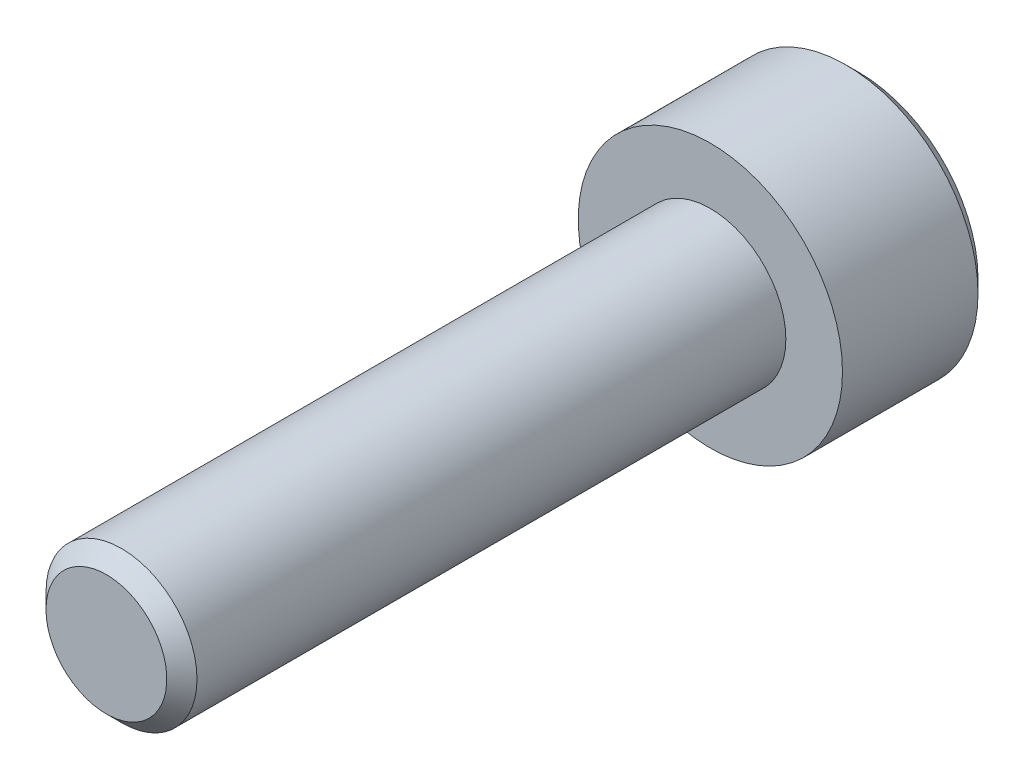
ISO-10303-21;
HEADER;
FILE_DESCRIPTION(('STEP AP214'),'2;1');
FILE_NAME('part.step','',(''),(''),'','','');
FILE_SCHEMA(('AUTOMOTIVE_DESIGN { 1 0 10303 214 1 1 1 1 }'));
ENDSEC;
DATA;
#1=APPLICATION_CONTEXT('core data for automotive mechanical design processes');
#2=APPLICATION_PROTOCOL_DEFINITION('international standard','automotive_design',2000,#1);
#3=PRODUCT_CONTEXT('',#1,'mechanical');
#4=PRODUCT('Part','Part','',(#3));
#5=PRODUCT_RELATED_PRODUCT_CATEGORY('part','',(#4));
#6=PRODUCT_DEFINITION_FORMATION('','',#4);
#7=PRODUCT_DEFINITION_CONTEXT('part definition',#1,'design');
#8=PRODUCT_DEFINITION('design','',#6,#7);
#9=PRODUCT_DEFINITION_SHAPE('','',#8);
#10=(LENGTH_UNIT() NAMED_UNIT(*) SI_UNIT(.MILLI.,.METRE.));
#11=(NAMED_UNIT(*) PLANE_ANGLE_UNIT() SI_UNIT($,.RADIAN.));
#12=(NAMED_UNIT(*) SI_UNIT($,.STERADIAN.) SOLID_ANGLE_UNIT());
#13=UNCERTAINTY_MEASURE_WITH_UNIT(LENGTH_MEASURE(1.E-05),#10,'distance_accuracy_value','');
#14=(GEOMETRIC_REPRESENTATION_CONTEXT(3) GLOBAL_UNCERTAINTY_ASSIGNED_CONTEXT((#13)) GLOBAL_UNIT_ASSIGNED_CONTEXT((#10,
#11,#12)) REPRESENTATION_CONTEXT('',''));
#15=CARTESIAN_POINT('',(0.,0.,0.));
#16=DIRECTION('',(0.,0.,1.));
#17=DIRECTION('',(1.,0.,0.));
#18=AXIS2_PLACEMENT_3D('',#15,#16,#17);
#19=CARTESIAN_POINT('',(1.5,0.866025403784438,-3.94));
#20=DIRECTION('',(1.,0.,0.));
#21=DIRECTION('',(0.,0.,-1.));
#22=AXIS2_PLACEMENT_3D('',#19,#20,#21);
#23=PLANE('',#22);
#24=DIRECTION('',(0.,1.,0.));
#25=VECTOR('',#24,1.);
#26=CARTESIAN_POINT('',(1.5,0.866025403784438,-1.94));
#27=LINE('',#26,#25);
#28=CARTESIAN_POINT('',(1.5,0.866025403784439,-1.94));
#29=VERTEX_POINT('',#28);
#30=CARTESIAN_POINT('',(1.5,-0.866025403784438,-1.94));
#31=VERTEX_POINT('',#30);
#32=EDGE_CURVE('E65',#29,#31,#27,.F.);
#33=ORIENTED_EDGE('',*,*,#32,.F.);
#34=DIRECTION('',(0.,0.,1.));
#35=VECTOR('',#34,1.);
#36=CARTESIAN_POINT('',(1.5,0.866025403784441,-3.94));
#37=LINE('',#36,#35);
#38=CARTESIAN_POINT('',(1.5,0.866025403784439,-3.94));
#39=VERTEX_POINT('',#38);
#40=EDGE_CURVE('E85',#29,#39,#37,.F.);
#41=ORIENTED_EDGE('',*,*,#40,.T.);
#42=DIRECTION('',(0.,1.,0.));
#43=VECTOR('',#42,1.);
#44=CARTESIAN_POINT('',(1.5,0.866025403784438,-3.94));
#45=LINE('',#44,#43);
#46=CARTESIAN_POINT('',(1.5,-0.866025403784438,-3.94));
#47=VERTEX_POINT('',#46);
#48=EDGE_CURVE('E74',#47,#39,#45,.T.);
#49=ORIENTED_EDGE('',*,*,#48,.F.);
#50=DIRECTION('',(0.,0.,1.));
#51=VECTOR('',#50,1.);
#52=CARTESIAN_POINT('',(1.5,-0.866025403784438,-3.94));
#53=LINE('',#52,#51);
#54=EDGE_CURVE('E80',#47,#31,#53,.T.);
#55=ORIENTED_EDGE('',*,*,#54,.T.);
#56=EDGE_LOOP('',(#33,#41,#49,#55));
#57=FACE_BOUND('',#56,.T.);
#58=ADVANCED_FACE('F17',(#57),#23,.F.);
#59=CARTESIAN_POINT('',(1.5,-0.866025403784438,-3.94));
#60=DIRECTION('',(0.499999999999999,-0.866025403784439,0.));
#61=DIRECTION('',(0.866025403784439,0.499999999999999,0.));
#62=AXIS2_PLACEMENT_3D('',#59,#60,#61);
#63=PLANE('',#62);
#64=DIRECTION('',(0.866025403784439,0.499999999999999,0.));
#65=VECTOR('',#64,1.);
#66=CARTESIAN_POINT('',(1.5,-0.866025403784438,-1.94));
#67=LINE('',#66,#65);
#68=CARTESIAN_POINT('',(0.,-1.73205080756888,-1.94));
#69=VERTEX_POINT('',#68);
#70=EDGE_CURVE('E89',#31,#69,#67,.F.);
#71=ORIENTED_EDGE('',*,*,#70,.F.);
#72=ORIENTED_EDGE('',*,*,#54,.F.);
#73=DIRECTION('',(0.866025403784439,0.499999999999999,0.));
#74=VECTOR('',#73,1.);
#75=CARTESIAN_POINT('',(1.5,-0.866025403784438,-3.94));
#76=LINE('',#75,#74);
#77=CARTESIAN_POINT('',(0.,-1.73205080756888,-3.94));
#78=VERTEX_POINT('',#77);
#79=EDGE_CURVE('E70',#78,#47,#76,.T.);
#80=ORIENTED_EDGE('',*,*,#79,.F.);
#81=DIRECTION('',(0.,0.,1.));
#82=VECTOR('',#81,1.);
#83=CARTESIAN_POINT('',(0.,-1.73205080756888,-3.94));
#84=LINE('',#83,#82);
#85=EDGE_CURVE('E133',#78,#69,#84,.T.);
#86=ORIENTED_EDGE('',*,*,#85,.T.);
#87=EDGE_LOOP('',(#71,#72,#80,#86));
#88=FACE_BOUND('',#87,.T.);
#89=ADVANCED_FACE('F88',(#88),#63,.F.);
#90=CARTESIAN_POINT('',(0.,1.73205080756888,-3.94));
#91=DIRECTION('',(0.5,0.866025403784439,0.));
#92=DIRECTION('',(-0.866025403784439,0.5,0.));
#93=AXIS2_PLACEMENT_3D('',#90,#91,#92);
#94=PLANE('',#93);
#95=DIRECTION('',(-0.866025403784438,0.500000000000002,0.));
#96=VECTOR('',#95,1.);
#97=CARTESIAN_POINT('',(1.5,0.866025403784438,-1.94));
#98=LINE('',#97,#96);
#99=CARTESIAN_POINT('',(0.,1.73205080756888,-1.94));
#100=VERTEX_POINT('',#99);
#101=EDGE_CURVE('E128',#29,#100,#98,.T.);
#102=ORIENTED_EDGE('',*,*,#101,.T.);
#103=DIRECTION('',(0.,0.,1.));
#104=VECTOR('',#103,1.);
#105=CARTESIAN_POINT('',(0.,1.73205080756888,-3.94));
#106=LINE('',#105,#104);
#107=CARTESIAN_POINT('',(0.,1.73205080756888,-3.94));
#108=VERTEX_POINT('',#107);
#109=EDGE_CURVE('E120',#100,#108,#106,.F.);
#110=ORIENTED_EDGE('',*,*,#109,.T.);
#111=DIRECTION('',(-0.866025403784439,0.5,0.));
#112=VECTOR('',#111,1.);
#113=CARTESIAN_POINT('',(0.,1.73205080756888,-3.94));
#114=LINE('',#113,#112);
#115=EDGE_CURVE('E91',#39,#108,#114,.T.);
#116=ORIENTED_EDGE('',*,*,#115,.F.);
#117=ORIENTED_EDGE('',*,*,#40,.F.);
#118=EDGE_LOOP('',(#102,#110,#116,#117));
#119=FACE_BOUND('',#118,.T.);
#120=ADVANCED_FACE('F139',(#119),#94,.F.);
#121=CARTESIAN_POINT('',(0.,-1.73205080756888,-3.94));
#122=DIRECTION('',(-0.5,-0.866025403784438,0.));
#123=DIRECTION('',(0.866025403784438,-0.5,0.));
#124=AXIS2_PLACEMENT_3D('',#121,#122,#123);
#125=PLANE('',#124);
#126=DIRECTION('',(0.866025403784438,-0.500000000000002,0.));
#127=VECTOR('',#126,1.);
#128=CARTESIAN_POINT('',(-1.5,-0.866025403784438,-1.94));
#129=LINE('',#128,#127);
#130=CARTESIAN_POINT('',(-1.5,-0.866025403784439,-1.94));
#131=VERTEX_POINT('',#130);
#132=EDGE_CURVE('E130',#131,#69,#129,.T.);
#133=ORIENTED_EDGE('',*,*,#132,.T.);
#134=ORIENTED_EDGE('',*,*,#85,.F.);
#135=DIRECTION('',(0.866025403784438,-0.5,0.));
#136=VECTOR('',#135,1.);
#137=CARTESIAN_POINT('',(0.,-1.73205080756888,-3.94));
#138=LINE('',#137,#136);
#139=CARTESIAN_POINT('',(-1.5,-0.866025403784439,-3.94));
#140=VERTEX_POINT('',#139);
#141=EDGE_CURVE('E35',#140,#78,#138,.T.);
#142=ORIENTED_EDGE('',*,*,#141,.F.);
#143=DIRECTION('',(0.,0.,1.));
#144=VECTOR('',#143,1.);
#145=CARTESIAN_POINT('',(-1.5,-0.866025403784438,-3.94));
#146=LINE('',#145,#144);
#147=EDGE_CURVE('E118',#140,#131,#146,.T.);
#148=ORIENTED_EDGE('',*,*,#147,.T.);
#149=EDGE_LOOP('',(#133,#134,#142,#148));
#150=FACE_BOUND('',#149,.T.);
#151=ADVANCED_FACE('F148',(#150),#125,.F.);
#152=CARTESIAN_POINT('',(0.,0.,-1.94));
#153=DIRECTION('',(0.,0.,1.));
#154=DIRECTION('',(1.,0.,0.));
#155=AXIS2_PLACEMENT_3D('',#152,#153,#154);
#156=PLANE('',#155);
#157=ORIENTED_EDGE('',*,*,#32,.T.);
#158=ORIENTED_EDGE('',*,*,#70,.T.);
#159=ORIENTED_EDGE('',*,*,#132,.F.);
#160=DIRECTION('',(0.,1.,0.));
#161=VECTOR('',#160,1.);
#162=CARTESIAN_POINT('',(-1.5,-0.866025403784438,-1.94));
#163=LINE('',#162,#161);
#164=CARTESIAN_POINT('',(-1.5,0.866025403784439,-1.94));
#165=VERTEX_POINT('',#164);
#166=EDGE_CURVE('E116',#131,#165,#163,.T.);
#167=ORIENTED_EDGE('',*,*,#166,.T.);
#168=DIRECTION('',(-0.866025403784439,-0.5,0.));
#169=VECTOR('',#168,1.);
#170=CARTESIAN_POINT('',(-1.5,0.866025403784439,-1.94));
#171=LINE('',#170,#169);
#172=EDGE_CURVE('E123',#165,#100,#171,.F.);
#173=ORIENTED_EDGE('',*,*,#172,.T.);
#174=ORIENTED_EDGE('',*,*,#101,.F.);
#175=EDGE_LOOP('',(#157,#158,#159,#167,#173,#174));
#176=FACE_BOUND('',#175,.T.);
#177=ADVANCED_FACE('F149',(#176),#156,.F.);
#178=CARTESIAN_POINT('',(-1.5,0.866025403784439,-3.94));
#179=DIRECTION('',(-0.5,0.866025403784439,0.));
#180=DIRECTION('',(-0.866025403784439,-0.5,0.));
#181=AXIS2_PLACEMENT_3D('',#178,#179,#180);
#182=PLANE('',#181);
#183=ORIENTED_EDGE('',*,*,#172,.F.);
#184=DIRECTION('',(0.,0.,1.));
#185=VECTOR('',#184,1.);
#186=CARTESIAN_POINT('',(-1.5,0.866025403784439,-3.94));
#187=LINE('',#186,#185);
#188=CARTESIAN_POINT('',(-1.5,0.866025403784439,-3.94));
#189=VERTEX_POINT('',#188);
#190=EDGE_CURVE('E113',#165,#189,#187,.F.);
#191=ORIENTED_EDGE('',*,*,#190,.T.);
#192=DIRECTION('',(-0.866025403784439,-0.5,0.));
#193=VECTOR('',#192,1.);
#194=CARTESIAN_POINT('',(-1.5,0.866025403784439,-3.94));
#195=LINE('',#194,#193);
#196=EDGE_CURVE('E126',#108,#189,#195,.T.);
#197=ORIENTED_EDGE('',*,*,#196,.F.);
#198=ORIENTED_EDGE('',*,*,#109,.F.);
#199=EDGE_LOOP('',(#183,#191,#197,#198));
#200=FACE_BOUND('',#199,.T.);
#201=ADVANCED_FACE('F142',(#200),#182,.F.);
#202=CARTESIAN_POINT('',(-1.5,-0.866025403784438,-3.94));
#203=DIRECTION('',(-1.,0.,0.));
#204=DIRECTION('',(0.,0.,1.));
#205=AXIS2_PLACEMENT_3D('',#202,#203,#204);
#206=PLANE('',#205);
#207=ORIENTED_EDGE('',*,*,#166,.F.);
#208=ORIENTED_EDGE('',*,*,#147,.F.);
#209=DIRECTION('',(0.,1.,0.));
#210=VECTOR('',#209,1.);
#211=CARTESIAN_POINT('',(-1.5,0.,-3.94));
#212=LINE('',#211,#210);
#213=EDGE_CURVE('E108',#140,#189,#212,.T.);
#214=ORIENTED_EDGE('',*,*,#213,.T.);
#215=ORIENTED_EDGE('',*,*,#190,.F.);
#216=EDGE_LOOP('',(#207,#208,#214,#215));
#217=FACE_BOUND('',#216,.T.);
#218=ADVANCED_FACE('F146',(#217),#206,.F.);
#219=CARTESIAN_POINT('',(0.,0.,-3.94));
#220=DIRECTION('',(0.,0.,1.));
#221=DIRECTION('',(1.,0.,0.));
#222=AXIS2_PLACEMENT_3D('',#219,#220,#221);
#223=PLANE('',#222);
#224=ORIENTED_EDGE('',*,*,#141,.T.);
#225=ORIENTED_EDGE('',*,*,#79,.T.);
#226=ORIENTED_EDGE('',*,*,#48,.T.);
#227=ORIENTED_EDGE('',*,*,#115,.T.);
#228=ORIENTED_EDGE('',*,*,#196,.T.);
#229=ORIENTED_EDGE('',*,*,#213,.F.);
#230=EDGE_LOOP('',(#224,#225,#226,#227,#228,#229));
#231=FACE_BOUND('',#230,.T.);
#232=CARTESIAN_POINT('',(0.,0.,-3.9400000000569));
#233=DIRECTION('',(0.,0.,1.));
#234=DIRECTION('',(1.,0.,0.));
#235=AXIS2_PLACEMENT_3D('',#232,#233,#234);
#236=CIRCLE('',#235,3.14999999994825);
#237=CARTESIAN_POINT('',(3.14999999994825,0.,-3.9400000000569));
#238=VERTEX_POINT('',#237);
#239=EDGE_CURVE('E20',#238,#238,#236,.T.);
#240=ORIENTED_EDGE('',*,*,#239,.F.);
#241=EDGE_LOOP('',(#240));
#242=FACE_BOUND('',#241,.T.);
#243=ADVANCED_FACE('F72',(#231,#242),#223,.F.);
#244=CARTESIAN_POINT('',(0.,0.,-3.59000000003107));
#245=DIRECTION('',(0.,0.,1.));
#246=DIRECTION('',(1.,0.,0.));
#247=AXIS2_PLACEMENT_3D('',#244,#245,#246);
#248=CONICAL_SURFACE('',#247,3.49999999997408,0.785398163397448);
#249=ORIENTED_EDGE('',*,*,#239,.T.);
#250=EDGE_LOOP('',(#249));
#251=FACE_BOUND('',#250,.T.);
#252=CARTESIAN_POINT('',(0.,0.,-3.59));
#253=DIRECTION('',(0.,0.,1.));
#254=DIRECTION('',(1.,0.,0.));
#255=AXIS2_PLACEMENT_3D('',#252,#253,#254);
#256=CIRCLE('',#255,3.5);
#257=CARTESIAN_POINT('',(3.5,0.,-3.59));
#258=VERTEX_POINT('',#257);
#259=EDGE_CURVE('E100',#258,#258,#256,.T.);
#260=ORIENTED_EDGE('',*,*,#259,.F.);
#261=EDGE_LOOP('',(#260));
#262=FACE_BOUND('',#261,.T.);
#263=ADVANCED_FACE('F181',(#251,#262),#248,.T.);
#264=CARTESIAN_POINT('',(0.,0.,16.));
#265=DIRECTION('',(0.,0.,1.));
#266=DIRECTION('',(1.,0.,0.));
#267=AXIS2_PLACEMENT_3D('',#264,#265,#266);
#268=PLANE('',#267);
#269=CARTESIAN_POINT('',(0.,0.,15.9999999999059));
#270=DIRECTION('',(0.,0.,-1.));
#271=DIRECTION('',(-1.,0.,0.));
#272=AXIS2_PLACEMENT_3D('',#269,#270,#271);
#273=CIRCLE('',#272,1.59999999999627);
#274=CARTESIAN_POINT('',(-1.59999999999627,0.,15.9999999999059));
#275=VERTEX_POINT('',#274);
#276=EDGE_CURVE('E98',#275,#275,#273,.T.);
#277=ORIENTED_EDGE('',*,*,#276,.F.);
#278=EDGE_LOOP('',(#277));
#279=FACE_BOUND('',#278,.T.);
#280=ADVANCED_FACE('F178',(#279),#268,.T.);
#281=CARTESIAN_POINT('',(0.,0.,-3.94));
#282=DIRECTION('',(0.,0.,1.));
#283=DIRECTION('',(1.,0.,0.));
#284=AXIS2_PLACEMENT_3D('',#281,#282,#283);
#285=CYLINDRICAL_SURFACE('',#284,3.5);
#286=ORIENTED_EDGE('',*,*,#259,.T.);
#287=EDGE_LOOP('',(#286));
#288=FACE_BOUND('',#287,.T.);
#289=CARTESIAN_POINT('',(0.,0.,0.));
#290=DIRECTION('',(0.,0.,1.));
#291=DIRECTION('',(1.,0.,0.));
#292=AXIS2_PLACEMENT_3D('',#289,#290,#291);
#293=CIRCLE('',#292,3.5);
#294=CARTESIAN_POINT('',(3.5,0.,0.));
#295=VERTEX_POINT('',#294);
#296=EDGE_CURVE('E96',#295,#295,#293,.T.);
#297=ORIENTED_EDGE('',*,*,#296,.F.);
#298=EDGE_LOOP('',(#297));
#299=FACE_BOUND('',#298,.T.);
#300=ADVANCED_FACE('F174',(#288,#299),#285,.T.);
#301=CARTESIAN_POINT('',(0.,0.,15.6000000000631));
#302=DIRECTION('',(0.,0.,-1.));
#303=DIRECTION('',(-1.,0.,0.));
#304=AXIS2_PLACEMENT_3D('',#301,#302,#303);
#305=CONICAL_SURFACE('',#304,1.99999999989586,0.785398163468503);
#306=CARTESIAN_POINT('',(0.,0.,15.6));
#307=DIRECTION('',(0.,0.,1.));
#308=DIRECTION('',(1.,0.,0.));
#309=AXIS2_PLACEMENT_3D('',#306,#307,#308);
#310=CIRCLE('',#309,2.);
#311=CARTESIAN_POINT('',(2.,0.,15.6));
#312=VERTEX_POINT('',#311);
#313=EDGE_CURVE('E26',#312,#312,#310,.F.);
#314=ORIENTED_EDGE('',*,*,#313,.F.);
#315=EDGE_LOOP('',(#314));
#316=FACE_BOUND('',#315,.T.);
#317=ORIENTED_EDGE('',*,*,#276,.T.);
#318=EDGE_LOOP('',(#317));
#319=FACE_BOUND('',#318,.T.);
#320=ADVANCED_FACE('F167',(#316,#319),#305,.T.);
#321=CARTESIAN_POINT('',(0.,0.,0.));
#322=DIRECTION('',(0.,0.,1.));
#323=DIRECTION('',(1.,0.,0.));
#324=AXIS2_PLACEMENT_3D('',#321,#322,#323);
#325=PLANE('',#324);
#326=CARTESIAN_POINT('',(0.,0.,0.));
#327=DIRECTION('',(0.,0.,1.));
#328=DIRECTION('',(1.,0.,0.));
#329=AXIS2_PLACEMENT_3D('',#326,#327,#328);
#330=CIRCLE('',#329,2.);
#331=CARTESIAN_POINT('',(2.,0.,0.));
#332=VERTEX_POINT('',#331);
#333=EDGE_CURVE('E11',#332,#332,#330,.T.);
#334=ORIENTED_EDGE('',*,*,#333,.F.);
#335=EDGE_LOOP('',(#334));
#336=FACE_BOUND('',#335,.T.);
#337=ORIENTED_EDGE('',*,*,#296,.T.);
#338=EDGE_LOOP('',(#337));
#339=FACE_BOUND('',#338,.T.);
#340=ADVANCED_FACE('F161',(#336,#339),#325,.T.);
#341=CARTESIAN_POINT('',(0.,0.,0.));
#342=DIRECTION('',(0.,0.,1.));
#343=DIRECTION('',(1.,0.,0.));
#344=AXIS2_PLACEMENT_3D('',#341,#342,#343);
#345=CYLINDRICAL_SURFACE('',#344,2.);
#346=ORIENTED_EDGE('',*,*,#333,.T.);
#347=EDGE_LOOP('',(#346));
#348=FACE_BOUND('',#347,.T.);
#349=ORIENTED_EDGE('',*,*,#313,.T.);
#350=EDGE_LOOP('',(#349));
#351=FACE_BOUND('',#350,.T.);
#352=ADVANCED_FACE('F159',(#348,#351),#345,.T.);
#353=CLOSED_SHELL('',(#58,#89,#120,#151,#177,#201,#218,#243,#263,#280,#300,#320,#340,#352));
#354=MANIFOLD_SOLID_BREP('B1',#353);
#355=ADVANCED_BREP_SHAPE_REPRESENTATION('',(#18,#354),#14);
#356=SHAPE_DEFINITION_REPRESENTATION(#9,#355);
ENDSEC;
END-ISO-10303-21;
